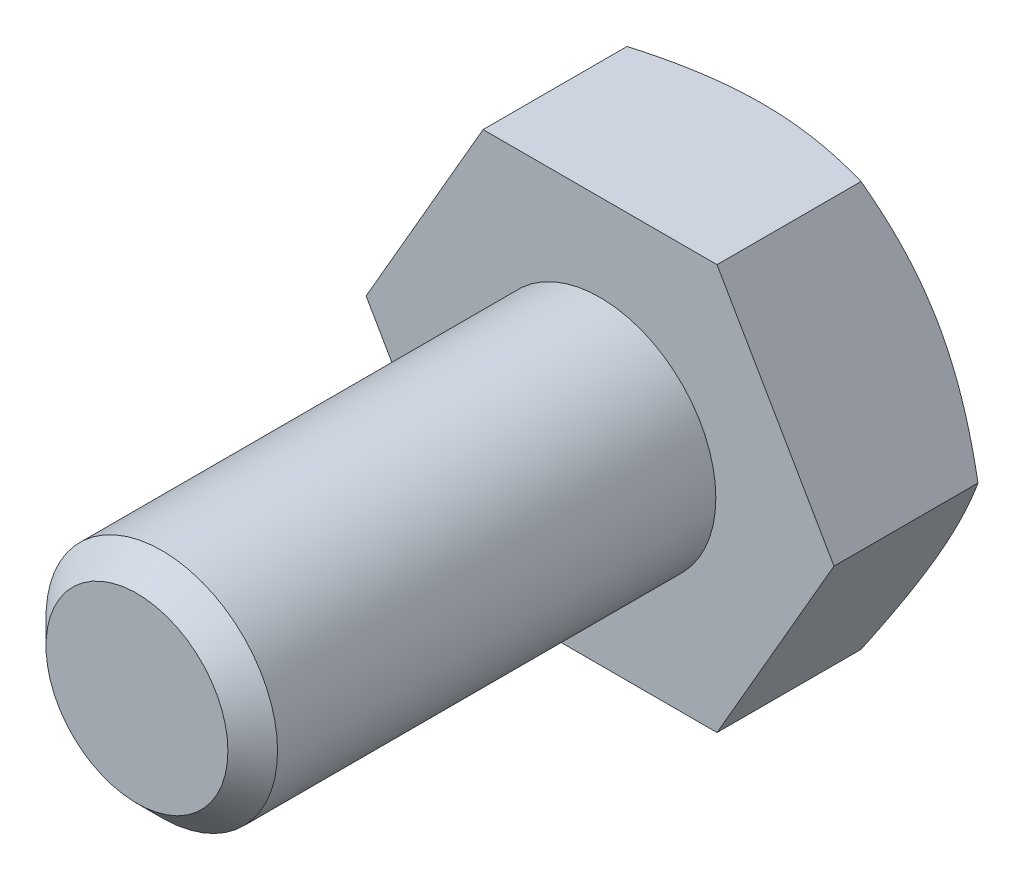
ISO-10303-21;
HEADER;
FILE_DESCRIPTION(('STEP AP214'),'2;1');
FILE_NAME('part.step','',(''),(''),'','','');
FILE_SCHEMA(('AUTOMOTIVE_DESIGN { 1 0 10303 214 1 1 1 1 }'));
ENDSEC;
DATA;
#1=APPLICATION_CONTEXT('core data for automotive mechanical design processes');
#2=APPLICATION_PROTOCOL_DEFINITION('international standard','automotive_design',2000,#1);
#3=PRODUCT_CONTEXT('',#1,'mechanical');
#4=PRODUCT('Part','Part','',(#3));
#5=PRODUCT_RELATED_PRODUCT_CATEGORY('part','',(#4));
#6=PRODUCT_DEFINITION_FORMATION('','',#4);
#7=PRODUCT_DEFINITION_CONTEXT('part definition',#1,'design');
#8=PRODUCT_DEFINITION('design','',#6,#7);
#9=PRODUCT_DEFINITION_SHAPE('','',#8);
#10=(LENGTH_UNIT() NAMED_UNIT(*) SI_UNIT(.MILLI.,.METRE.));
#11=(NAMED_UNIT(*) PLANE_ANGLE_UNIT() SI_UNIT($,.RADIAN.));
#12=(NAMED_UNIT(*) SI_UNIT($,.STERADIAN.) SOLID_ANGLE_UNIT());
#13=UNCERTAINTY_MEASURE_WITH_UNIT(LENGTH_MEASURE(1.E-05),#10,'distance_accuracy_value','');
#14=(GEOMETRIC_REPRESENTATION_CONTEXT(3) GLOBAL_UNCERTAINTY_ASSIGNED_CONTEXT((#13)) GLOBAL_UNIT_ASSIGNED_CONTEXT((#10,
#11,#12)) REPRESENTATION_CONTEXT('',''));
#15=CARTESIAN_POINT('',(0.,0.,0.));
#16=DIRECTION('',(0.,0.,1.));
#17=DIRECTION('',(1.,0.,0.));
#18=AXIS2_PLACEMENT_3D('',#15,#16,#17);
#19=CARTESIAN_POINT('',(2.02072594216369,-3.5,2.8));
#20=DIRECTION('',(-0.866025403784439,0.5,0.));
#21=DIRECTION('',(-0.5,-0.866025403784439,0.));
#22=AXIS2_PLACEMENT_3D('',#19,#20,#21);
#23=PLANE('',#22);
#24=CARTESIAN_POINT('',(4.04156735438122,0.000200000000000556,0.312674060693354));
#25=CARTESIAN_POINT('',(3.9527667384984,-0.153607178452449,0.261385788989966));
#26=CARTESIAN_POINT('',(3.86319960126198,-0.308742010834424,0.214740953816182));
#27=CARTESIAN_POINT('',(3.68251437287562,-0.621698006576781,0.133321875533336));
#28=CARTESIAN_POINT('',(3.59139307116725,-0.779524730787496,0.0985764355845498));
#29=CARTESIAN_POINT('',(3.41027974688034,-1.09322221038013,0.0444900271828204));
#30=CARTESIAN_POINT('',(3.32031559103708,-1.24904469916069,0.0247890862603611));
#31=CARTESIAN_POINT('',(3.13996396008052,-1.56142288720537,0.00127013273723282));
#32=CARTESIAN_POINT('',(3.04957714051106,-1.71797745103423,-0.00256735545445257));
#33=CARTESIAN_POINT('',(2.88068384499777,-2.01050921992099,0.00541530187696167));
#34=CARTESIAN_POINT('',(2.80215208834114,-2.1465302124579,0.0152754340695898));
#35=CARTESIAN_POINT('',(2.64560020969753,-2.41768602028899,0.0465264668993816));
#36=CARTESIAN_POINT('',(2.5675806292065,-2.55281989768468,0.0679280432857728));
#37=CARTESIAN_POINT('',(2.41070596159678,-2.82453479240518,0.121430407880551));
#38=CARTESIAN_POINT('',(2.33187072981463,-2.96108141927833,0.153757994445063));
#39=CARTESIAN_POINT('',(2.17537608630783,-3.2321380929445,0.227128933807975));
#40=CARTESIAN_POINT('',(2.09771466960098,-3.36665161246853,0.268155046569849));
#41=CARTESIAN_POINT('',(2.02061047210985,-3.5002,0.312674060693349));
#42=B_SPLINE_CURVE_WITH_KNOTS('',3,(#24,#25,#26,#27,#28,#29,#30,#31,#32,#33,#34,#35,#36,#37,#38,
#39,#40,#41),.UNSPECIFIED.,.F.,.F.,(4,2,2,2,2,2,2,2,4),(0.,0.554793832886253,1.11092123814984,
1.65328467083219,2.19498204478403,2.6666513085086,3.13875761298267,3.6213361260051,
4.10296698719187),.UNSPECIFIED.);
#43=CARTESIAN_POINT('',(4.04145188432737,0.,0.312607391169611));
#44=VERTEX_POINT('',#43);
#45=CARTESIAN_POINT('',(3.03108891324553,-1.75,0.));
#46=VERTEX_POINT('',#45);
#47=EDGE_CURVE('E124',#44,#46,#42,.T.);
#48=ORIENTED_EDGE('',*,*,#47,.F.);
#49=DIRECTION('',(0.,0.,-1.));
#50=VECTOR('',#49,1.);
#51=CARTESIAN_POINT('',(4.04145188432738,0.,2.8));
#52=LINE('',#51,#50);
#53=CARTESIAN_POINT('',(4.04145188432738,0.,2.8));
#54=VERTEX_POINT('',#53);
#55=EDGE_CURVE('E128',#54,#44,#52,.T.);
#56=ORIENTED_EDGE('',*,*,#55,.F.);
#57=DIRECTION('',(0.5,0.866025403784438,0.));
#58=VECTOR('',#57,1.);
#59=CARTESIAN_POINT('',(2.02072594216369,-3.5,2.8));
#60=LINE('',#59,#58);
#61=CARTESIAN_POINT('',(2.02072594216369,-3.5,2.8));
#62=VERTEX_POINT('',#61);
#63=EDGE_CURVE('E242',#62,#54,#60,.T.);
#64=ORIENTED_EDGE('',*,*,#63,.F.);
#65=DIRECTION('',(0.,0.,-1.));
#66=VECTOR('',#65,1.);
#67=CARTESIAN_POINT('',(2.02072594216369,-3.5,2.8));
#68=LINE('',#67,#66);
#69=CARTESIAN_POINT('',(2.02072594216366,-3.5,0.312607391169612));
#70=VERTEX_POINT('',#69);
#71=EDGE_CURVE('E218',#62,#70,#68,.T.);
#72=ORIENTED_EDGE('',*,*,#71,.T.);
#73=EDGE_CURVE('E181',#46,#70,#42,.T.);
#74=ORIENTED_EDGE('',*,*,#73,.F.);
#75=EDGE_LOOP('',(#48,#56,#64,#72,#74));
#76=FACE_BOUND('',#75,.T.);
#77=ADVANCED_FACE('F32',(#76),#23,.F.);
#78=CARTESIAN_POINT('',(4.04145188432738,0.,2.8));
#79=DIRECTION('',(-0.866025403784438,-0.5,0.));
#80=DIRECTION('',(0.5,-0.866025403784438,0.));
#81=AXIS2_PLACEMENT_3D('',#78,#79,#80);
#82=PLANE('',#81);
#83=CARTESIAN_POINT('',(2.02061047210985,3.5002,0.312674060693355));
#84=CARTESIAN_POINT('',(2.10941108799267,3.34639282154755,0.261385788989959));
#85=CARTESIAN_POINT('',(2.19897822522909,3.19125798916558,0.214740953816174));
#86=CARTESIAN_POINT('',(2.37966345361545,2.87830199342322,0.133321875533331));
#87=CARTESIAN_POINT('',(2.47078475532382,2.7204752692125,0.0985764355845486));
#88=CARTESIAN_POINT('',(2.65189807961073,2.40677778961987,0.0444900271828213));
#89=CARTESIAN_POINT('',(2.74186223545399,2.25095530083931,0.0247890862603603));
#90=CARTESIAN_POINT('',(2.92221386641055,1.93857711279463,0.00127013273723137));
#91=CARTESIAN_POINT('',(3.01260068598001,1.78202254896577,-0.00256735545445318));
#92=CARTESIAN_POINT('',(3.1814939814933,1.48949078007901,0.00541530187696319));
#93=CARTESIAN_POINT('',(3.26002573814993,1.35346978754209,0.0152754340695926));
#94=CARTESIAN_POINT('',(3.41657761679354,1.08231397971101,0.0465264668993881));
#95=CARTESIAN_POINT('',(3.49459719728457,0.947180102315318,0.067928043285782));
#96=CARTESIAN_POINT('',(3.65147186489429,0.675465207594817,0.121430407880559));
#97=CARTESIAN_POINT('',(3.73030709667644,0.538918580721665,0.153757994445068));
#98=CARTESIAN_POINT('',(3.88680174018324,0.267861907055498,0.227128933807973));
#99=CARTESIAN_POINT('',(3.96446315689009,0.133348387531463,0.268155046569846));
#100=CARTESIAN_POINT('',(4.04156735438122,-0.000199999999999692,0.31267406069335));
#101=B_SPLINE_CURVE_WITH_KNOTS('',3,(#83,#84,#85,#86,#87,#88,#89,#90,#91,#92,#93,#94,#95,#96,
#97,#98,#99,#100),.UNSPECIFIED.,.F.,.F.,(4,2,2,2,2,2,2,2,4),(0.,0.554793832886253,
1.11092123814984,1.65328467083219,2.19498204478403,2.6666513085086,3.13875761298267,
3.6213361260051,4.10296698719187),.UNSPECIFIED.);
#102=CARTESIAN_POINT('',(2.0207259421637,3.49999999999997,0.312607391169611));
#103=VERTEX_POINT('',#102);
#104=CARTESIAN_POINT('',(3.03108891324553,1.75,0.));
#105=VERTEX_POINT('',#104);
#106=EDGE_CURVE('E103',#103,#105,#101,.T.);
#107=ORIENTED_EDGE('',*,*,#106,.F.);
#108=DIRECTION('',(0.,0.,-1.));
#109=VECTOR('',#108,1.);
#110=CARTESIAN_POINT('',(2.02072594216369,3.5,2.8));
#111=LINE('',#110,#109);
#112=CARTESIAN_POINT('',(2.02072594216369,3.5,2.8));
#113=VERTEX_POINT('',#112);
#114=EDGE_CURVE('E227',#113,#103,#111,.T.);
#115=ORIENTED_EDGE('',*,*,#114,.F.);
#116=DIRECTION('',(-0.5,0.866025403784438,0.));
#117=VECTOR('',#116,1.);
#118=CARTESIAN_POINT('',(4.04145188432738,0.,2.8));
#119=LINE('',#118,#117);
#120=EDGE_CURVE('E246',#54,#113,#119,.T.);
#121=ORIENTED_EDGE('',*,*,#120,.F.);
#122=ORIENTED_EDGE('',*,*,#55,.T.);
#123=EDGE_CURVE('E116',#105,#44,#101,.T.);
#124=ORIENTED_EDGE('',*,*,#123,.F.);
#125=EDGE_LOOP('',(#107,#115,#121,#122,#124));
#126=FACE_BOUND('',#125,.T.);
#127=ADVANCED_FACE('F136',(#126),#82,.F.);
#128=CARTESIAN_POINT('',(2.02072594216369,3.5,2.8));
#129=DIRECTION('',(0.,-1.,0.));
#130=DIRECTION('',(1.,0.,0.));
#131=AXIS2_PLACEMENT_3D('',#128,#129,#130);
#132=PLANE('',#131);
#133=CARTESIAN_POINT('',(-5.51155991662166,3.5,1.7487697232408));
#134=CARTESIAN_POINT('',(-5.35795146497442,3.5,1.67392336064347));
#135=CARTESIAN_POINT('',(-5.20399921327066,3.5,1.59977092634844));
#136=CARTESIAN_POINT('',(-4.89522455167778,3.5,1.45324265223555));
#137=CARTESIAN_POINT('',(-4.74040201636207,3.5,1.38086707701138));
#138=CARTESIAN_POINT('',(-4.42894615294239,3.5,1.23793493399991));
#139=CARTESIAN_POINT('',(-4.27230760071021,3.5,1.16738971193147));
#140=CARTESIAN_POINT('',(-3.95781335407224,3.5,1.02907715201443));
#141=CARTESIAN_POINT('',(-3.7999577152429,3.5,0.961309688205766));
#142=CARTESIAN_POINT('',(-3.4774111334268,3.5,0.827049258068232));
#143=CARTESIAN_POINT('',(-3.3126696619141,3.5,0.760677040301366));
#144=CARTESIAN_POINT('',(-2.98129055334351,3.5,0.632756391222577));
#145=CARTESIAN_POINT('',(-2.81465271050397,3.5,0.571208489240945));
#146=CARTESIAN_POINT('',(-2.47950135142084,3.5,0.454490935593606));
#147=CARTESIAN_POINT('',(-2.31099212961239,3.5,0.399309072522224));
#148=CARTESIAN_POINT('',(-1.97155788075463,3.5,0.297038623207348));
#149=CARTESIAN_POINT('',(-1.80063360563483,3.5,0.249947575461067));
#150=CARTESIAN_POINT('',(-1.4572176944235,3.5,0.166312731904432));
#151=CARTESIAN_POINT('',(-1.28474069132431,3.5,0.129709932809715));
#152=CARTESIAN_POINT('',(-0.937557024710316,3.5,0.0690664437905796));
#153=CARTESIAN_POINT('',(-0.762850605780841,3.5,0.0450243877823631));
#154=CARTESIAN_POINT('',(-0.414396255839326,3.5,0.0117307990577348));
#155=CARTESIAN_POINT('',(-0.240667591359064,3.5,0.00228260576821214));
#156=CARTESIAN_POINT('',(0.106974361978112,3.5,-0.00154556657181174));
#157=CARTESIAN_POINT('',(0.280887653519258,3.5,0.0040746765368135));
#158=CARTESIAN_POINT('',(0.57367773206962,3.5,0.0258160056757064));
#159=CARTESIAN_POINT('',(0.692856455403474,3.5,0.0381294865222616));
#160=CARTESIAN_POINT('',(0.930390572672181,3.5,0.0691104276210565));
#161=CARTESIAN_POINT('',(1.04874586201748,3.5,0.0877786805228636));
#162=CARTESIAN_POINT('',(1.40238821330865,3.5,0.152339395828359));
#163=CARTESIAN_POINT('',(1.63613518289362,3.5,0.206777964761816));
#164=CARTESIAN_POINT('',(1.98584040996061,3.5,0.301818253779714));
#165=CARTESIAN_POINT('',(2.10359260845122,3.5,0.336200478121217));
#166=CARTESIAN_POINT('',(2.33795453185625,3.5,0.408694226179515));
#167=CARTESIAN_POINT('',(2.45456424794998,3.5,0.446805778664169));
#168=CARTESIAN_POINT('',(2.68667648799219,3.5,0.526133501179578));
#169=CARTESIAN_POINT('',(2.80217931315365,3.5,0.567348797905193));
#170=CARTESIAN_POINT('',(3.03221622488003,3.5,0.652383319257545));
#171=CARTESIAN_POINT('',(3.14675033363066,3.5,0.696202484064544));
#172=CARTESIAN_POINT('',(3.45518824791987,3.5,0.817586420524226));
#173=CARTESIAN_POINT('',(3.64827858653488,3.5,0.897216284270007));
#174=CARTESIAN_POINT('',(4.03246734047175,3.5,1.06116121789351));
#175=CARTESIAN_POINT('',(4.22356553103577,3.5,1.14547680977308));
#176=CARTESIAN_POINT('',(4.60422080385888,3.5,1.3176802251643));
#177=CARTESIAN_POINT('',(4.79377732281038,3.5,1.40556928969839));
#178=CARTESIAN_POINT('',(5.17160543290686,3.5,1.58407294349367));
#179=CARTESIAN_POINT('',(5.3598769842319,3.5,1.67468761675266));
#180=CARTESIAN_POINT('',(5.73567568482785,3.5,1.85818750995006));
#181=CARTESIAN_POINT('',(5.92320119337957,3.5,1.95107608308061));
#182=CARTESIAN_POINT('',(6.2974040162792,3.5,2.13854805180961));
#183=CARTESIAN_POINT('',(6.48408132155385,3.5,2.23313146548457));
#184=CARTESIAN_POINT('',(7.04299370869453,3.5,2.51886265052553));
#185=CARTESIAN_POINT('',(7.41419418882237,3.5,2.71203324279833));
#186=CARTESIAN_POINT('',(8.11545297659333,3.5,3.081310909229));
#187=CARTESIAN_POINT('',(8.44570240889789,3.5,3.25705680052897));
#188=CARTESIAN_POINT('',(9.10509095555404,3.5,3.61066708174038));
#189=CARTESIAN_POINT('',(9.43422999967598,3.5,3.78853160254254));
#190=CARTESIAN_POINT('',(10.0905480477554,3.5,4.14522643287855));
#191=CARTESIAN_POINT('',(10.4177299197431,3.5,4.32405147354832));
#192=CARTESIAN_POINT('',(11.0714005829853,3.5,4.68290305461305));
#193=CARTESIAN_POINT('',(11.3978894271807,3.5,4.86292949853346));
#194=CARTESIAN_POINT('',(11.7241348746726,3.5,5.04339321876764));
#195=B_SPLINE_CURVE_WITH_KNOTS('',3,(#133,#134,#135,#136,#137,#138,#139,#140,#141,#142,#143,
#144,#145,#146,#147,#148,#149,#150,#151,#152,#153,#154,#155,#156,#157,#158,#159,#160,#161,#162,
#163,#164,#165,#166,#167,#168,#169,#170,#171,#172,#173,#174,#175,#176,#177,#178,#179,#180,#181,
#182,#183,#184,#185,#186,#187,#188,#189,#190,#191,#192,#193,#194),.UNSPECIFIED.,.F.,.F.,(4,2,2,
2,2,2,2,2,2,2,2,2,2,2,2,2,2,2,2,2,2,2,2,2,2,2,2,2,2,2,4),(0.,0.512624455455558,1.02532478887103,
1.54067716699584,2.05600615007007,2.58877526866932,3.12160276180876,3.65339055960881,
4.18501628177852,4.71358975001965,5.24210571958897,5.76343550668357,6.28477297996431,
6.64403977825951,7.00335140539847,7.72232402673615,8.09029790450666,8.45827462103385,
8.82614818350625,9.19401329793224,9.82051720822946,10.4470910530887,11.0738843896344,
11.7006970625238,12.3284975533834,12.9563047441025,14.211635085947,15.33392926628,
16.4562931462709,17.574877685398,18.6933734561263),.UNSPECIFIED.);
#196=CARTESIAN_POINT('',(-2.02072594216371,3.49999999999997,0.312607391169613));
#197=VERTEX_POINT('',#196);
#198=CARTESIAN_POINT('',(0.,3.5,0.));
#199=VERTEX_POINT('',#198);
#200=EDGE_CURVE('E47',#197,#199,#195,.T.);
#201=ORIENTED_EDGE('',*,*,#200,.F.);
#202=DIRECTION('',(0.,0.,-1.));
#203=VECTOR('',#202,1.);
#204=CARTESIAN_POINT('',(-2.02072594216369,3.5,2.8));
#205=LINE('',#204,#203);
#206=CARTESIAN_POINT('',(-2.02072594216369,3.5,2.8));
#207=VERTEX_POINT('',#206);
#208=EDGE_CURVE('E220',#207,#197,#205,.T.);
#209=ORIENTED_EDGE('',*,*,#208,.F.);
#210=DIRECTION('',(-1.,0.,0.));
#211=VECTOR('',#210,1.);
#212=CARTESIAN_POINT('',(2.02072594216369,3.5,2.8));
#213=LINE('',#212,#211);
#214=EDGE_CURVE('E250',#113,#207,#213,.T.);
#215=ORIENTED_EDGE('',*,*,#214,.F.);
#216=ORIENTED_EDGE('',*,*,#114,.T.);
#217=EDGE_CURVE('E110',#199,#103,#195,.T.);
#218=ORIENTED_EDGE('',*,*,#217,.F.);
#219=EDGE_LOOP('',(#201,#209,#215,#216,#218));
#220=FACE_BOUND('',#219,.T.);
#221=ADVANCED_FACE('F191',(#220),#132,.F.);
#222=CARTESIAN_POINT('',(-2.02072594216369,3.5,2.8));
#223=DIRECTION('',(0.866025403784439,-0.5,0.));
#224=DIRECTION('',(0.5,0.866025403784439,0.));
#225=AXIS2_PLACEMENT_3D('',#222,#223,#224);
#226=PLANE('',#225);
#227=CARTESIAN_POINT('',(-4.04156735438122,-0.000199999999999569,0.312674060693354));
#228=CARTESIAN_POINT('',(-3.9527667384984,0.153607178452449,0.261385788989958));
#229=CARTESIAN_POINT('',(-3.86319960126198,0.308742010834423,0.214740953816173));
#230=CARTESIAN_POINT('',(-3.68251437287562,0.621698006576781,0.13332187553333));
#231=CARTESIAN_POINT('',(-3.59139307116725,0.779524730787496,0.0985764355845477));
#232=CARTESIAN_POINT('',(-3.41027974688034,1.09322221038013,0.0444900271828205));
#233=CARTESIAN_POINT('',(-3.32031559103708,1.24904469916069,0.0247890862603597));
#234=CARTESIAN_POINT('',(-3.13996396008052,1.56142288720537,0.00127013273723073));
#235=CARTESIAN_POINT('',(-3.04957714051106,1.71797745103423,-0.00256735545445396));
#236=CARTESIAN_POINT('',(-2.88068384499777,2.01050921992099,0.00541530187696251));
#237=CARTESIAN_POINT('',(-2.80215208834114,2.14653021245791,0.0152754340695921));
#238=CARTESIAN_POINT('',(-2.64560020969753,2.41768602028899,0.0465264668993877));
#239=CARTESIAN_POINT('',(-2.5675806292065,2.55281989768468,0.0679280432857816));
#240=CARTESIAN_POINT('',(-2.41070596159678,2.82453479240518,0.121430407880558));
#241=CARTESIAN_POINT('',(-2.33187072981463,2.96108141927834,0.153757994445067));
#242=CARTESIAN_POINT('',(-2.17537608630783,3.2321380929445,0.227128933807973));
#243=CARTESIAN_POINT('',(-2.09771466960098,3.36665161246854,0.268155046569845));
#244=CARTESIAN_POINT('',(-2.02061047210985,3.5002,0.312674060693349));
#245=B_SPLINE_CURVE_WITH_KNOTS('',3,(#227,#228,#229,#230,#231,#232,#233,#234,#235,#236,#237,
#238,#239,#240,#241,#242,#243,#244),.UNSPECIFIED.,.F.,.F.,(4,2,2,2,2,2,2,2,4),(0.,
0.554793832886253,1.11092123814984,1.65328467083219,2.19498204478403,2.6666513085086,
3.13875761298267,3.6213361260051,4.10296698719187),.UNSPECIFIED.);
#246=CARTESIAN_POINT('',(-4.04145188432736,0.,0.312607391169614));
#247=VERTEX_POINT('',#246);
#248=CARTESIAN_POINT('',(-3.03108891324553,1.75,0.));
#249=VERTEX_POINT('',#248);
#250=EDGE_CURVE('E55',#247,#249,#245,.T.);
#251=ORIENTED_EDGE('',*,*,#250,.F.);
#252=DIRECTION('',(0.,0.,-1.));
#253=VECTOR('',#252,1.);
#254=CARTESIAN_POINT('',(-4.04145188432738,0.,2.8));
#255=LINE('',#254,#253);
#256=CARTESIAN_POINT('',(-4.04145188432738,0.,2.8));
#257=VERTEX_POINT('',#256);
#258=EDGE_CURVE('E217',#257,#247,#255,.T.);
#259=ORIENTED_EDGE('',*,*,#258,.F.);
#260=DIRECTION('',(-0.5,-0.866025403784439,0.));
#261=VECTOR('',#260,1.);
#262=CARTESIAN_POINT('',(-2.02072594216369,3.5,2.8));
#263=LINE('',#262,#261);
#264=EDGE_CURVE('E252',#207,#257,#263,.T.);
#265=ORIENTED_EDGE('',*,*,#264,.F.);
#266=ORIENTED_EDGE('',*,*,#208,.T.);
#267=EDGE_CURVE('E115',#249,#197,#245,.T.);
#268=ORIENTED_EDGE('',*,*,#267,.F.);
#269=EDGE_LOOP('',(#251,#259,#265,#266,#268));
#270=FACE_BOUND('',#269,.T.);
#271=ADVANCED_FACE('F236',(#270),#226,.F.);
#272=CARTESIAN_POINT('',(-4.04145188432738,0.,2.8));
#273=DIRECTION('',(0.866025403784438,0.5,0.));
#274=DIRECTION('',(-0.5,0.866025403784439,0.));
#275=AXIS2_PLACEMENT_3D('',#272,#273,#274);
#276=PLANE('',#275);
#277=CARTESIAN_POINT('',(-2.02061047210985,-3.5002,0.312674060693354));
#278=CARTESIAN_POINT('',(-2.10941108799267,-3.34639282154755,0.261385788989959));
#279=CARTESIAN_POINT('',(-2.19897822522909,-3.19125798916558,0.214740953816173));
#280=CARTESIAN_POINT('',(-2.37966345361545,-2.87830199342322,0.133321875533331));
#281=CARTESIAN_POINT('',(-2.47078475532382,-2.7204752692125,0.0985764355845489));
#282=CARTESIAN_POINT('',(-2.65189807961073,-2.40677778961987,0.0444900271828216));
#283=CARTESIAN_POINT('',(-2.74186223545399,-2.25095530083931,0.0247890862603605));
#284=CARTESIAN_POINT('',(-2.92221386641055,-1.93857711279463,0.00127013273723147));
#285=CARTESIAN_POINT('',(-3.01260068598001,-1.78202254896577,-0.002567355454453));
#286=CARTESIAN_POINT('',(-3.1814939814933,-1.48949078007901,0.00541530187696338));
#287=CARTESIAN_POINT('',(-3.26002573814993,-1.35346978754209,0.0152754340695927));
#288=CARTESIAN_POINT('',(-3.41657761679354,-1.08231397971101,0.0465264668993882));
#289=CARTESIAN_POINT('',(-3.49459719728457,-0.947180102315317,0.0679280432857821));
#290=CARTESIAN_POINT('',(-3.65147186489429,-0.675465207594816,0.121430407880559));
#291=CARTESIAN_POINT('',(-3.73030709667644,-0.538918580721664,0.153757994445068));
#292=CARTESIAN_POINT('',(-3.88680174018324,-0.267861907055498,0.227128933807973));
#293=CARTESIAN_POINT('',(-3.96446315689009,-0.133348387531463,0.268155046569846));
#294=CARTESIAN_POINT('',(-4.04156735438122,0.00020000000000045,0.31267406069335));
#295=B_SPLINE_CURVE_WITH_KNOTS('',3,(#277,#278,#279,#280,#281,#282,#283,#284,#285,#286,#287,
#288,#289,#290,#291,#292,#293,#294),.UNSPECIFIED.,.F.,.F.,(4,2,2,2,2,2,2,2,4),(0.,
0.554793832886253,1.11092123814984,1.65328467083219,2.19498204478403,2.6666513085086,
3.13875761298267,3.6213361260051,4.10296698719187),.UNSPECIFIED.);
#296=CARTESIAN_POINT('',(-2.02072594216382,-3.5,0.312607391169507));
#297=VERTEX_POINT('',#296);
#298=CARTESIAN_POINT('',(-3.03108891324553,-1.75,0.));
#299=VERTEX_POINT('',#298);
#300=EDGE_CURVE('E175',#297,#299,#295,.T.);
#301=ORIENTED_EDGE('',*,*,#300,.F.);
#302=DIRECTION('',(0.,0.,-1.));
#303=VECTOR('',#302,1.);
#304=CARTESIAN_POINT('',(-2.02072594216369,-3.5,2.8));
#305=LINE('',#304,#303);
#306=CARTESIAN_POINT('',(-2.02072594216369,-3.5,2.8));
#307=VERTEX_POINT('',#306);
#308=EDGE_CURVE('E211',#307,#297,#305,.T.);
#309=ORIENTED_EDGE('',*,*,#308,.F.);
#310=DIRECTION('',(0.5,-0.866025403784438,0.));
#311=VECTOR('',#310,1.);
#312=CARTESIAN_POINT('',(-4.04145188432738,0.,2.8));
#313=LINE('',#312,#311);
#314=EDGE_CURVE('E254',#257,#307,#313,.T.);
#315=ORIENTED_EDGE('',*,*,#314,.F.);
#316=ORIENTED_EDGE('',*,*,#258,.T.);
#317=EDGE_CURVE('E138',#299,#247,#295,.T.);
#318=ORIENTED_EDGE('',*,*,#317,.F.);
#319=EDGE_LOOP('',(#301,#309,#315,#316,#318));
#320=FACE_BOUND('',#319,.T.);
#321=ADVANCED_FACE('F209',(#320),#276,.F.);
#322=CARTESIAN_POINT('',(-2.02072594216369,-3.5,2.8));
#323=DIRECTION('',(0.,1.,0.));
#324=DIRECTION('',(-1.,0.,0.));
#325=AXIS2_PLACEMENT_3D('',#322,#323,#324);
#326=PLANE('',#325);
#327=CARTESIAN_POINT('',(-5.51155991662166,-3.5,1.7487697232408));
#328=CARTESIAN_POINT('',(-5.35795146497442,-3.5,1.67392336064347));
#329=CARTESIAN_POINT('',(-5.20399921327066,-3.5,1.59977092634844));
#330=CARTESIAN_POINT('',(-4.89522455167778,-3.5,1.45324265223555));
#331=CARTESIAN_POINT('',(-4.74040201636207,-3.5,1.38086707701138));
#332=CARTESIAN_POINT('',(-4.42894615294238,-3.5,1.23793493399991));
#333=CARTESIAN_POINT('',(-4.27230760071021,-3.5,1.16738971193148));
#334=CARTESIAN_POINT('',(-3.95781335407224,-3.5,1.02907715201444));
#335=CARTESIAN_POINT('',(-3.7999577152429,-3.5,0.961309688205767));
#336=CARTESIAN_POINT('',(-3.47741113342679,-3.5,0.827049258068232));
#337=CARTESIAN_POINT('',(-3.31266966191409,-3.5,0.760677040301368));
#338=CARTESIAN_POINT('',(-2.9812905533435,-3.5,0.63275639122258));
#339=CARTESIAN_POINT('',(-2.81465271050397,-3.5,0.571208489240947));
#340=CARTESIAN_POINT('',(-2.47950135142084,-3.5,0.454490935593607));
#341=CARTESIAN_POINT('',(-2.31099212961239,-3.5,0.399309072522227));
#342=CARTESIAN_POINT('',(-1.97155788075463,-3.5,0.297038623207347));
#343=CARTESIAN_POINT('',(-1.80063360563483,-3.5,0.249947575461058));
#344=CARTESIAN_POINT('',(-1.45721769442351,-3.5,0.166312731904425));
#345=CARTESIAN_POINT('',(-1.28474069132431,-3.5,0.129709932809716));
#346=CARTESIAN_POINT('',(-0.937557024710317,-3.5,0.0690664437905821));
#347=CARTESIAN_POINT('',(-0.762850605780843,-3.5,0.0450243877823588));
#348=CARTESIAN_POINT('',(-0.414396255839327,-3.5,0.0117307990577321));
#349=CARTESIAN_POINT('',(-0.240667591359065,-3.5,0.00228260576821773));
#350=CARTESIAN_POINT('',(0.106974361978112,-3.5,-0.00154556657180519));
#351=CARTESIAN_POINT('',(0.280887653519259,-3.5,0.00407467653681272));
#352=CARTESIAN_POINT('',(0.57367773206962,-3.5,0.0258160056757066));
#353=CARTESIAN_POINT('',(0.692856455403473,-3.5,0.0381294865222659));
#354=CARTESIAN_POINT('',(0.93039057267218,-3.5,0.0691104276210595));
#355=CARTESIAN_POINT('',(1.04874586201748,-3.5,0.0877786805228612));
#356=CARTESIAN_POINT('',(1.40238821330865,-3.5,0.152339395828354));
#357=CARTESIAN_POINT('',(1.63613518289362,-3.5,0.206777964761825));
#358=CARTESIAN_POINT('',(1.98584040996061,-3.5,0.301818253779719));
#359=CARTESIAN_POINT('',(2.10359260845122,-3.5,0.336200478121216));
#360=CARTESIAN_POINT('',(2.33795453185625,-3.5,0.408694226179512));
#361=CARTESIAN_POINT('',(2.45456424794998,-3.5,0.446805778664169));
#362=CARTESIAN_POINT('',(2.68667648799219,-3.5,0.526133501179579));
#363=CARTESIAN_POINT('',(2.80217931315365,-3.5,0.567348797905191));
#364=CARTESIAN_POINT('',(3.03221622488003,-3.5,0.652383319257539));
#365=CARTESIAN_POINT('',(3.14675033363066,-3.5,0.696202484064536));
#366=CARTESIAN_POINT('',(3.45518824791987,-3.5,0.817586420524217));
#367=CARTESIAN_POINT('',(3.64827858653488,-3.5,0.897216284270001));
#368=CARTESIAN_POINT('',(4.03246734047174,-3.5,1.06116121789351));
#369=CARTESIAN_POINT('',(4.22356553103577,-3.5,1.14547680977308));
#370=CARTESIAN_POINT('',(4.60422080385887,-3.5,1.3176802251643));
#371=CARTESIAN_POINT('',(4.79377732281037,-3.5,1.40556928969839));
#372=CARTESIAN_POINT('',(5.17160543290685,-3.5,1.58407294349367));
#373=CARTESIAN_POINT('',(5.3598769842319,-3.5,1.67468761675265));
#374=CARTESIAN_POINT('',(5.73567568482785,-3.5,1.85818750995004));
#375=CARTESIAN_POINT('',(5.92320119337957,-3.5,1.9510760830806));
#376=CARTESIAN_POINT('',(6.29740401627919,-3.5,2.13854805180961));
#377=CARTESIAN_POINT('',(6.48408132155384,-3.5,2.23313146548456));
#378=CARTESIAN_POINT('',(7.04299370869452,-3.5,2.51886265052553));
#379=CARTESIAN_POINT('',(7.41419418882236,-3.5,2.71203324279832));
#380=CARTESIAN_POINT('',(8.11545297659332,-3.5,3.08131090922899));
#381=CARTESIAN_POINT('',(8.44570240889788,-3.5,3.25705680052897));
#382=CARTESIAN_POINT('',(9.10509095555403,-3.5,3.61066708174039));
#383=CARTESIAN_POINT('',(9.43422999967598,-3.5,3.78853160254255));
#384=CARTESIAN_POINT('',(10.0905480477554,-3.5,4.14522643287855));
#385=CARTESIAN_POINT('',(10.4177299197431,-3.5,4.32405147354831));
#386=CARTESIAN_POINT('',(11.0714005829853,-3.5,4.68290305461304));
#387=CARTESIAN_POINT('',(11.3978894271807,-3.5,4.86292949853345));
#388=CARTESIAN_POINT('',(11.7241348746726,-3.5,5.04339321876764));
#389=B_SPLINE_CURVE_WITH_KNOTS('',3,(#327,#328,#329,#330,#331,#332,#333,#334,#335,#336,#337,
#338,#339,#340,#341,#342,#343,#344,#345,#346,#347,#348,#349,#350,#351,#352,#353,#354,#355,#356,
#357,#358,#359,#360,#361,#362,#363,#364,#365,#366,#367,#368,#369,#370,#371,#372,#373,#374,#375,
#376,#377,#378,#379,#380,#381,#382,#383,#384,#385,#386,#387,#388),.UNSPECIFIED.,.F.,.F.,(4,2,2,
2,2,2,2,2,2,2,2,2,2,2,2,2,2,2,2,2,2,2,2,2,2,2,2,2,2,2,4),(0.,0.512624455455558,1.02532478887103,
1.54067716699584,2.05600615007007,2.58877526866932,3.12160276180876,3.65339055960881,
4.18501628177852,4.71358975001965,5.24210571958897,5.76343550668357,6.28477297996431,
6.64403977825951,7.00335140539847,7.72232402673615,8.09029790450666,8.45827462103385,
8.82614818350625,9.19401329793224,9.82051720822946,10.4470910530887,11.0738843896344,
11.7006970625238,12.3284975533834,12.9563047441025,14.211635085947,15.33392926628,
16.4562931462709,17.574877685398,18.6933734561263),.UNSPECIFIED.);
#390=CARTESIAN_POINT('',(0.,-3.5,0.));
#391=VERTEX_POINT('',#390);
#392=EDGE_CURVE('E195',#70,#391,#389,.F.);
#393=ORIENTED_EDGE('',*,*,#392,.F.);
#394=ORIENTED_EDGE('',*,*,#71,.F.);
#395=DIRECTION('',(1.,0.,0.));
#396=VECTOR('',#395,1.);
#397=CARTESIAN_POINT('',(-2.02072594216369,-3.5,2.8));
#398=LINE('',#397,#396);
#399=EDGE_CURVE('E216',#307,#62,#398,.T.);
#400=ORIENTED_EDGE('',*,*,#399,.F.);
#401=ORIENTED_EDGE('',*,*,#308,.T.);
#402=EDGE_CURVE('E133',#391,#297,#389,.F.);
#403=ORIENTED_EDGE('',*,*,#402,.F.);
#404=EDGE_LOOP('',(#393,#394,#400,#401,#403));
#405=FACE_BOUND('',#404,.T.);
#406=ADVANCED_FACE('F214',(#405),#326,.F.);
#407=CARTESIAN_POINT('',(4.04145188432738,0.,2.8));
#408=DIRECTION('',(0.,0.,1.));
#409=DIRECTION('',(1.,0.,0.));
#410=AXIS2_PLACEMENT_3D('',#407,#408,#409);
#411=PLANE('',#410);
#412=ORIENTED_EDGE('',*,*,#63,.T.);
#413=ORIENTED_EDGE('',*,*,#120,.T.);
#414=ORIENTED_EDGE('',*,*,#214,.T.);
#415=ORIENTED_EDGE('',*,*,#264,.T.);
#416=ORIENTED_EDGE('',*,*,#314,.T.);
#417=ORIENTED_EDGE('',*,*,#399,.T.);
#418=EDGE_LOOP('',(#412,#413,#414,#415,#416,#417));
#419=FACE_BOUND('',#418,.T.);
#420=CARTESIAN_POINT('',(0.,0.,2.8));
#421=DIRECTION('',(0.,0.,1.));
#422=DIRECTION('',(1.,0.,0.));
#423=AXIS2_PLACEMENT_3D('',#420,#421,#422);
#424=CIRCLE('',#423,2.);
#425=CARTESIAN_POINT('',(2.,0.,2.8));
#426=VERTEX_POINT('',#425);
#427=EDGE_CURVE('E240',#426,#426,#424,.T.);
#428=ORIENTED_EDGE('',*,*,#427,.F.);
#429=EDGE_LOOP('',(#428));
#430=FACE_BOUND('',#429,.T.);
#431=ADVANCED_FACE('F256',(#419,#430),#411,.T.);
#432=CARTESIAN_POINT('',(0.,0.,10.8));
#433=DIRECTION('',(0.,0.,-1.));
#434=DIRECTION('',(-1.,0.,0.));
#435=AXIS2_PLACEMENT_3D('',#432,#433,#434);
#436=CYLINDRICAL_SURFACE('',#435,2.);
#437=CARTESIAN_POINT('',(0.,0.,10.371));
#438=DIRECTION('',(0.,0.,1.));
#439=DIRECTION('',(1.,0.,0.));
#440=AXIS2_PLACEMENT_3D('',#437,#438,#439);
#441=CIRCLE('',#440,2.);
#442=CARTESIAN_POINT('',(2.,0.,10.371));
#443=VERTEX_POINT('',#442);
#444=EDGE_CURVE('E11',#443,#443,#441,.F.);
#445=ORIENTED_EDGE('',*,*,#444,.T.);
#446=EDGE_LOOP('',(#445));
#447=FACE_BOUND('',#446,.T.);
#448=ORIENTED_EDGE('',*,*,#427,.T.);
#449=EDGE_LOOP('',(#448));
#450=FACE_BOUND('',#449,.T.);
#451=ADVANCED_FACE('F274',(#447,#450),#436,.T.);
#452=CARTESIAN_POINT('',(0.,0.,10.8));
#453=DIRECTION('',(0.,0.,1.));
#454=DIRECTION('',(1.,0.,0.));
#455=AXIS2_PLACEMENT_3D('',#452,#453,#454);
#456=PLANE('',#455);
#457=CARTESIAN_POINT('',(0.,0.,10.8));
#458=DIRECTION('',(0.,0.,1.));
#459=DIRECTION('',(1.,0.,0.));
#460=AXIS2_PLACEMENT_3D('',#457,#458,#459);
#461=CIRCLE('',#460,1.571);
#462=CARTESIAN_POINT('',(1.571,0.,10.8));
#463=VERTEX_POINT('',#462);
#464=EDGE_CURVE('E40',#463,#463,#461,.T.);
#465=ORIENTED_EDGE('',*,*,#464,.T.);
#466=EDGE_LOOP('',(#465));
#467=FACE_BOUND('',#466,.T.);
#468=ADVANCED_FACE('F163',(#467),#456,.T.);
#469=CARTESIAN_POINT('',(0.,0.,57.7350269189618));
#470=DIRECTION('',(0.,0.,1.));
#471=DIRECTION('',(1.,0.,0.));
#472=AXIS2_PLACEMENT_3D('',#469,#470,#471);
#473=CONICAL_SURFACE('',#472,103.5,1.0471975511966);
#474=ORIENTED_EDGE('',*,*,#123,.T.);
#475=ORIENTED_EDGE('',*,*,#47,.T.);
#476=CARTESIAN_POINT('',(0.,0.,0.));
#477=DIRECTION('',(0.,0.,1.));
#478=DIRECTION('',(1.,0.,0.));
#479=AXIS2_PLACEMENT_3D('',#476,#477,#478);
#480=CIRCLE('',#479,3.50000000000002);
#481=EDGE_CURVE('E121',#46,#105,#480,.T.);
#482=ORIENTED_EDGE('',*,*,#481,.T.);
#483=EDGE_LOOP('',(#474,#475,#482));
#484=FACE_BOUND('',#483,.T.);
#485=ADVANCED_FACE('F122',(#484),#473,.T.);
#486=ORIENTED_EDGE('',*,*,#73,.T.);
#487=ORIENTED_EDGE('',*,*,#392,.T.);
#488=EDGE_CURVE('E127',#391,#46,#480,.T.);
#489=ORIENTED_EDGE('',*,*,#488,.T.);
#490=EDGE_LOOP('',(#486,#487,#489));
#491=FACE_BOUND('',#490,.T.);
#492=ADVANCED_FACE('F233',(#491),#473,.T.);
#493=ORIENTED_EDGE('',*,*,#300,.T.);
#494=EDGE_CURVE('E204',#299,#391,#480,.T.);
#495=ORIENTED_EDGE('',*,*,#494,.T.);
#496=ORIENTED_EDGE('',*,*,#402,.T.);
#497=EDGE_LOOP('',(#493,#495,#496));
#498=FACE_BOUND('',#497,.T.);
#499=ADVANCED_FACE('F162',(#498),#473,.T.);
#500=ORIENTED_EDGE('',*,*,#250,.T.);
#501=EDGE_CURVE('E232',#249,#299,#480,.T.);
#502=ORIENTED_EDGE('',*,*,#501,.T.);
#503=ORIENTED_EDGE('',*,*,#317,.T.);
#504=EDGE_LOOP('',(#500,#502,#503));
#505=FACE_BOUND('',#504,.T.);
#506=ADVANCED_FACE('F161',(#505),#473,.T.);
#507=ORIENTED_EDGE('',*,*,#200,.T.);
#508=EDGE_CURVE('E130',#199,#249,#480,.T.);
#509=ORIENTED_EDGE('',*,*,#508,.T.);
#510=ORIENTED_EDGE('',*,*,#267,.T.);
#511=EDGE_LOOP('',(#507,#509,#510));
#512=FACE_BOUND('',#511,.T.);
#513=ADVANCED_FACE('F157',(#512),#473,.T.);
#514=ORIENTED_EDGE('',*,*,#217,.T.);
#515=ORIENTED_EDGE('',*,*,#106,.T.);
#516=CARTESIAN_POINT('',(0.,0.,0.));
#517=DIRECTION('',(0.,0.,1.));
#518=DIRECTION('',(1.,0.,0.));
#519=AXIS2_PLACEMENT_3D('',#516,#517,#518);
#520=CIRCLE('',#519,3.5);
#521=EDGE_CURVE('E107',#105,#199,#520,.T.);
#522=ORIENTED_EDGE('',*,*,#521,.T.);
#523=EDGE_LOOP('',(#514,#515,#522));
#524=FACE_BOUND('',#523,.T.);
#525=ADVANCED_FACE('F105',(#524),#473,.T.);
#526=CARTESIAN_POINT('',(4.04145188432738,0.,0.));
#527=DIRECTION('',(0.,0.,1.));
#528=DIRECTION('',(1.,0.,0.));
#529=AXIS2_PLACEMENT_3D('',#526,#527,#528);
#530=PLANE('',#529);
#531=ORIENTED_EDGE('',*,*,#521,.F.);
#532=ORIENTED_EDGE('',*,*,#481,.F.);
#533=ORIENTED_EDGE('',*,*,#488,.F.);
#534=ORIENTED_EDGE('',*,*,#494,.F.);
#535=ORIENTED_EDGE('',*,*,#501,.F.);
#536=ORIENTED_EDGE('',*,*,#508,.F.);
#537=EDGE_LOOP('',(#531,#532,#533,#534,#535,#536));
#538=FACE_BOUND('',#537,.T.);
#539=ADVANCED_FACE('F131',(#538),#530,.F.);
#540=CARTESIAN_POINT('',(0.,0.,10.8));
#541=DIRECTION('',(0.,0.,-1.));
#542=DIRECTION('',(-1.,0.,0.));
#543=AXIS2_PLACEMENT_3D('',#540,#541,#542);
#544=CONICAL_SURFACE('',#543,1.571,0.785398163397448);
#545=ORIENTED_EDGE('',*,*,#444,.F.);
#546=EDGE_LOOP('',(#545));
#547=FACE_BOUND('',#546,.T.);
#548=ORIENTED_EDGE('',*,*,#464,.F.);
#549=EDGE_LOOP('',(#548));
#550=FACE_BOUND('',#549,.T.);
#551=ADVANCED_FACE('F34',(#547,#550),#544,.T.);
#552=CLOSED_SHELL('',(#77,#127,#221,#271,#321,#406,#431,#451,#468,#485,#492,#499,#506,#513,#525,
#539,#551));
#553=MANIFOLD_SOLID_BREP('B2',#552);
#554=ADVANCED_BREP_SHAPE_REPRESENTATION('',(#18,#553),#14);
#555=SHAPE_DEFINITION_REPRESENTATION(#9,#554);
ENDSEC;
END-ISO-10303-21;
